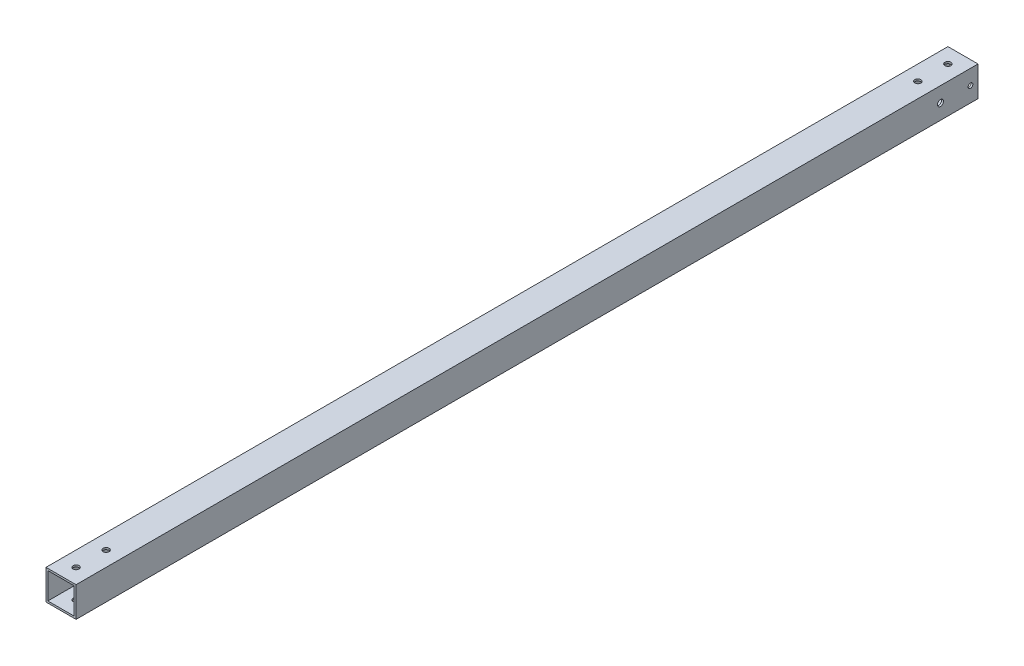
ISO-10303-21;
HEADER;
FILE_DESCRIPTION(('STEP AP214'),'2;1');
FILE_NAME('part.step','',(''),(''),'','','');
FILE_SCHEMA(('AUTOMOTIVE_DESIGN { 1 0 10303 214 1 1 1 1 }'));
ENDSEC;
DATA;
#1=APPLICATION_CONTEXT('core data for automotive mechanical design processes');
#2=APPLICATION_PROTOCOL_DEFINITION('international standard','automotive_design',2000,#1);
#3=PRODUCT_CONTEXT('',#1,'mechanical');
#4=PRODUCT('Part','Part','',(#3));
#5=PRODUCT_RELATED_PRODUCT_CATEGORY('part','',(#4));
#6=PRODUCT_DEFINITION_FORMATION('','',#4);
#7=PRODUCT_DEFINITION_CONTEXT('part definition',#1,'design');
#8=PRODUCT_DEFINITION('design','',#6,#7);
#9=PRODUCT_DEFINITION_SHAPE('','',#8);
#10=(LENGTH_UNIT() NAMED_UNIT(*) SI_UNIT(.MILLI.,.METRE.));
#11=(NAMED_UNIT(*) PLANE_ANGLE_UNIT() SI_UNIT($,.RADIAN.));
#12=(NAMED_UNIT(*) SI_UNIT($,.STERADIAN.) SOLID_ANGLE_UNIT());
#13=UNCERTAINTY_MEASURE_WITH_UNIT(LENGTH_MEASURE(1.E-05),#10,'distance_accuracy_value','');
#14=(GEOMETRIC_REPRESENTATION_CONTEXT(3) GLOBAL_UNCERTAINTY_ASSIGNED_CONTEXT((#13)) GLOBAL_UNIT_ASSIGNED_CONTEXT((#10,
#11,#12)) REPRESENTATION_CONTEXT('',''));
#15=CARTESIAN_POINT('',(0.,0.,0.));
#16=DIRECTION('',(0.,0.,1.));
#17=DIRECTION('',(1.,0.,0.));
#18=AXIS2_PLACEMENT_3D('',#15,#16,#17);
#19=CARTESIAN_POINT('',(0.,0.,762.));
#20=DIRECTION('',(0.,0.,-1.));
#21=DIRECTION('',(-1.,0.,0.));
#22=AXIS2_PLACEMENT_3D('',#19,#20,#21);
#23=PLANE('',#22);
#24=DIRECTION('',(0.,-1.,0.));
#25=VECTOR('',#24,1.);
#26=CARTESIAN_POINT('',(0.,0.,762.));
#27=LINE('',#26,#25);
#28=CARTESIAN_POINT('',(0.,25.4,762.));
#29=VERTEX_POINT('',#28);
#30=CARTESIAN_POINT('',(0.,0.,762.));
#31=VERTEX_POINT('',#30);
#32=EDGE_CURVE('E157',#29,#31,#27,.T.);
#33=ORIENTED_EDGE('',*,*,#32,.T.);
#34=DIRECTION('',(1.,0.,0.));
#35=VECTOR('',#34,1.);
#36=CARTESIAN_POINT('',(0.,0.,762.));
#37=LINE('',#36,#35);
#38=CARTESIAN_POINT('',(25.4,0.,762.));
#39=VERTEX_POINT('',#38);
#40=EDGE_CURVE('E161',#31,#39,#37,.T.);
#41=ORIENTED_EDGE('',*,*,#40,.T.);
#42=DIRECTION('',(0.,1.,0.));
#43=VECTOR('',#42,1.);
#44=CARTESIAN_POINT('',(25.4,0.,762.));
#45=LINE('',#44,#43);
#46=CARTESIAN_POINT('',(25.4,25.4,762.));
#47=VERTEX_POINT('',#46);
#48=EDGE_CURVE('E165',#39,#47,#45,.T.);
#49=ORIENTED_EDGE('',*,*,#48,.T.);
#50=DIRECTION('',(-1.,0.,0.));
#51=VECTOR('',#50,1.);
#52=CARTESIAN_POINT('',(0.,25.4,762.));
#53=LINE('',#52,#51);
#54=EDGE_CURVE('E168',#47,#29,#53,.T.);
#55=ORIENTED_EDGE('',*,*,#54,.T.);
#56=EDGE_LOOP('',(#33,#41,#49,#55));
#57=FACE_BOUND('',#56,.T.);
#58=DIRECTION('',(0.,-1.,0.));
#59=VECTOR('',#58,1.);
#60=CARTESIAN_POINT('',(1.5875,1.5875,762.));
#61=LINE('',#60,#59);
#62=CARTESIAN_POINT('',(1.5875,23.8125,762.));
#63=VERTEX_POINT('',#62);
#64=CARTESIAN_POINT('',(1.5875,1.5875,762.));
#65=VERTEX_POINT('',#64);
#66=EDGE_CURVE('E107',#63,#65,#61,.T.);
#67=ORIENTED_EDGE('',*,*,#66,.F.);
#68=DIRECTION('',(-1.,0.,0.));
#69=VECTOR('',#68,1.);
#70=CARTESIAN_POINT('',(1.5875,23.8125,762.));
#71=LINE('',#70,#69);
#72=CARTESIAN_POINT('',(23.8125,23.8125,762.));
#73=VERTEX_POINT('',#72);
#74=EDGE_CURVE('E133',#73,#63,#71,.T.);
#75=ORIENTED_EDGE('',*,*,#74,.F.);
#76=DIRECTION('',(0.,1.,0.));
#77=VECTOR('',#76,1.);
#78=CARTESIAN_POINT('',(23.8125,1.5875,762.));
#79=LINE('',#78,#77);
#80=CARTESIAN_POINT('',(23.8125,1.5875,762.));
#81=VERTEX_POINT('',#80);
#82=EDGE_CURVE('E129',#81,#73,#79,.T.);
#83=ORIENTED_EDGE('',*,*,#82,.F.);
#84=DIRECTION('',(1.,0.,0.));
#85=VECTOR('',#84,1.);
#86=CARTESIAN_POINT('',(1.5875,1.5875,762.));
#87=LINE('',#86,#85);
#88=EDGE_CURVE('E116',#65,#81,#87,.T.);
#89=ORIENTED_EDGE('',*,*,#88,.F.);
#90=EDGE_LOOP('',(#67,#75,#83,#89));
#91=FACE_BOUND('',#90,.T.);
#92=ADVANCED_FACE('F39',(#57,#91),#23,.F.);
#93=CARTESIAN_POINT('',(0.,0.,0.));
#94=DIRECTION('',(0.,0.,-1.));
#95=DIRECTION('',(-1.,0.,0.));
#96=AXIS2_PLACEMENT_3D('',#93,#94,#95);
#97=PLANE('',#96);
#98=DIRECTION('',(0.,-1.,0.));
#99=VECTOR('',#98,1.);
#100=CARTESIAN_POINT('',(0.,0.,0.));
#101=LINE('',#100,#99);
#102=CARTESIAN_POINT('',(0.,25.4,0.));
#103=VERTEX_POINT('',#102);
#104=CARTESIAN_POINT('',(0.,0.,0.));
#105=VERTEX_POINT('',#104);
#106=EDGE_CURVE('E125',#103,#105,#101,.T.);
#107=ORIENTED_EDGE('',*,*,#106,.F.);
#108=DIRECTION('',(-1.,0.,0.));
#109=VECTOR('',#108,1.);
#110=CARTESIAN_POINT('',(0.,25.4,0.));
#111=LINE('',#110,#109);
#112=CARTESIAN_POINT('',(25.4,25.4,0.));
#113=VERTEX_POINT('',#112);
#114=EDGE_CURVE('E162',#113,#103,#111,.T.);
#115=ORIENTED_EDGE('',*,*,#114,.F.);
#116=DIRECTION('',(0.,1.,0.));
#117=VECTOR('',#116,1.);
#118=CARTESIAN_POINT('',(25.4,0.,0.));
#119=LINE('',#118,#117);
#120=CARTESIAN_POINT('',(25.4,0.,0.));
#121=VERTEX_POINT('',#120);
#122=EDGE_CURVE('E178',#121,#113,#119,.T.);
#123=ORIENTED_EDGE('',*,*,#122,.F.);
#124=DIRECTION('',(1.,0.,0.));
#125=VECTOR('',#124,1.);
#126=CARTESIAN_POINT('',(0.,0.,0.));
#127=LINE('',#126,#125);
#128=EDGE_CURVE('E175',#105,#121,#127,.T.);
#129=ORIENTED_EDGE('',*,*,#128,.F.);
#130=EDGE_LOOP('',(#107,#115,#123,#129));
#131=FACE_BOUND('',#130,.T.);
#132=DIRECTION('',(-1.,0.,0.));
#133=VECTOR('',#132,1.);
#134=CARTESIAN_POINT('',(1.5875,23.8125,0.));
#135=LINE('',#134,#133);
#136=CARTESIAN_POINT('',(23.8125,23.8125,0.));
#137=VERTEX_POINT('',#136);
#138=CARTESIAN_POINT('',(1.5875,23.8125,0.));
#139=VERTEX_POINT('',#138);
#140=EDGE_CURVE('E117',#137,#139,#135,.T.);
#141=ORIENTED_EDGE('',*,*,#140,.T.);
#142=DIRECTION('',(0.,-1.,0.));
#143=VECTOR('',#142,1.);
#144=CARTESIAN_POINT('',(1.5875,1.5875,0.));
#145=LINE('',#144,#143);
#146=CARTESIAN_POINT('',(1.5875,1.5875,0.));
#147=VERTEX_POINT('',#146);
#148=EDGE_CURVE('E65',#139,#147,#145,.T.);
#149=ORIENTED_EDGE('',*,*,#148,.T.);
#150=DIRECTION('',(1.,0.,0.));
#151=VECTOR('',#150,1.);
#152=CARTESIAN_POINT('',(1.5875,1.5875,0.));
#153=LINE('',#152,#151);
#154=CARTESIAN_POINT('',(23.8125,1.5875,0.));
#155=VERTEX_POINT('',#154);
#156=EDGE_CURVE('E123',#147,#155,#153,.T.);
#157=ORIENTED_EDGE('',*,*,#156,.T.);
#158=DIRECTION('',(0.,1.,0.));
#159=VECTOR('',#158,1.);
#160=CARTESIAN_POINT('',(23.8125,1.5875,0.));
#161=LINE('',#160,#159);
#162=EDGE_CURVE('E144',#155,#137,#161,.T.);
#163=ORIENTED_EDGE('',*,*,#162,.T.);
#164=EDGE_LOOP('',(#141,#149,#157,#163));
#165=FACE_BOUND('',#164,.T.);
#166=ADVANCED_FACE('F242',(#131,#165),#97,.T.);
#167=CARTESIAN_POINT('',(0.,0.,762.));
#168=DIRECTION('',(1.,0.,0.));
#169=DIRECTION('',(0.,0.,-1.));
#170=AXIS2_PLACEMENT_3D('',#167,#168,#169);
#171=PLANE('',#170);
#172=CARTESIAN_POINT('',(0.,12.7,39.6875));
#173=DIRECTION('',(-1.,0.,0.));
#174=DIRECTION('',(0.,0.,1.));
#175=AXIS2_PLACEMENT_3D('',#172,#173,#174);
#176=CIRCLE('',#175,2.54);
#177=CARTESIAN_POINT('',(0.,12.7,42.2275));
#178=VERTEX_POINT('',#177);
#179=EDGE_CURVE('E337',#178,#178,#176,.T.);
#180=ORIENTED_EDGE('',*,*,#179,.F.);
#181=EDGE_LOOP('',(#180));
#182=FACE_BOUND('',#181,.T.);
#183=CARTESIAN_POINT('',(0.,12.7,722.3125));
#184=DIRECTION('',(-1.,0.,0.));
#185=DIRECTION('',(0.,0.,-1.));
#186=AXIS2_PLACEMENT_3D('',#183,#184,#185);
#187=CIRCLE('',#186,2.53999999999996);
#188=CARTESIAN_POINT('',(0.,12.7,724.8525));
#189=VERTEX_POINT('',#188);
#190=EDGE_CURVE('E347',#189,#189,#187,.T.);
#191=ORIENTED_EDGE('',*,*,#190,.F.);
#192=EDGE_LOOP('',(#191));
#193=FACE_BOUND('',#192,.T.);
#194=ORIENTED_EDGE('',*,*,#106,.T.);
#195=DIRECTION('',(0.,0.,-1.));
#196=VECTOR('',#195,1.);
#197=CARTESIAN_POINT('',(0.,0.,762.));
#198=LINE('',#197,#196);
#199=EDGE_CURVE('E11',#31,#105,#198,.T.);
#200=ORIENTED_EDGE('',*,*,#199,.F.);
#201=ORIENTED_EDGE('',*,*,#32,.F.);
#202=DIRECTION('',(0.,0.,-1.));
#203=VECTOR('',#202,1.);
#204=CARTESIAN_POINT('',(0.,25.4,762.));
#205=LINE('',#204,#203);
#206=EDGE_CURVE('E171',#29,#103,#205,.T.);
#207=ORIENTED_EDGE('',*,*,#206,.T.);
#208=EDGE_LOOP('',(#194,#200,#201,#207));
#209=FACE_BOUND('',#208,.T.);
#210=ADVANCED_FACE('F41',(#182,#193,#209),#171,.F.);
#211=CARTESIAN_POINT('',(0.,0.,762.));
#212=DIRECTION('',(0.,1.,0.));
#213=DIRECTION('',(0.,0.,1.));
#214=AXIS2_PLACEMENT_3D('',#211,#212,#213);
#215=PLANE('',#214);
#216=CARTESIAN_POINT('',(12.7,0.,12.7));
#217=DIRECTION('',(0.,1.,0.));
#218=DIRECTION('',(0.,0.,1.));
#219=AXIS2_PLACEMENT_3D('',#216,#217,#218);
#220=CIRCLE('',#219,2.54);
#221=CARTESIAN_POINT('',(12.7,0.,15.24));
#222=VERTEX_POINT('',#221);
#223=EDGE_CURVE('E198',#222,#222,#220,.T.);
#224=ORIENTED_EDGE('',*,*,#223,.T.);
#225=EDGE_LOOP('',(#224));
#226=FACE_BOUND('',#225,.T.);
#227=CARTESIAN_POINT('',(12.7,0.,723.9));
#228=DIRECTION('',(0.,1.,0.));
#229=DIRECTION('',(0.,0.,-1.));
#230=AXIS2_PLACEMENT_3D('',#227,#228,#229);
#231=CIRCLE('',#230,2.53999999999992);
#232=CARTESIAN_POINT('',(12.7,0.,721.36));
#233=VERTEX_POINT('',#232);
#234=EDGE_CURVE('E284',#233,#233,#231,.T.);
#235=ORIENTED_EDGE('',*,*,#234,.T.);
#236=EDGE_LOOP('',(#235));
#237=FACE_BOUND('',#236,.T.);
#238=CARTESIAN_POINT('',(12.7,0.,38.1));
#239=DIRECTION('',(0.,1.,0.));
#240=DIRECTION('',(0.,0.,1.));
#241=AXIS2_PLACEMENT_3D('',#238,#239,#240);
#242=CIRCLE('',#241,2.54);
#243=CARTESIAN_POINT('',(12.7,0.,40.64));
#244=VERTEX_POINT('',#243);
#245=EDGE_CURVE('E288',#244,#244,#242,.T.);
#246=ORIENTED_EDGE('',*,*,#245,.T.);
#247=EDGE_LOOP('',(#246));
#248=FACE_BOUND('',#247,.T.);
#249=CARTESIAN_POINT('',(12.7,0.,749.3));
#250=DIRECTION('',(0.,1.,0.));
#251=DIRECTION('',(0.,0.,-1.));
#252=AXIS2_PLACEMENT_3D('',#249,#250,#251);
#253=CIRCLE('',#252,2.53999999999994);
#254=CARTESIAN_POINT('',(12.7,0.,746.76));
#255=VERTEX_POINT('',#254);
#256=EDGE_CURVE('E292',#255,#255,#253,.T.);
#257=ORIENTED_EDGE('',*,*,#256,.T.);
#258=EDGE_LOOP('',(#257));
#259=FACE_BOUND('',#258,.T.);
#260=ORIENTED_EDGE('',*,*,#128,.T.);
#261=DIRECTION('',(0.,0.,-1.));
#262=VECTOR('',#261,1.);
#263=CARTESIAN_POINT('',(25.4,0.,762.));
#264=LINE('',#263,#262);
#265=EDGE_CURVE('E49',#39,#121,#264,.T.);
#266=ORIENTED_EDGE('',*,*,#265,.F.);
#267=ORIENTED_EDGE('',*,*,#40,.F.);
#268=ORIENTED_EDGE('',*,*,#199,.T.);
#269=EDGE_LOOP('',(#260,#266,#267,#268));
#270=FACE_BOUND('',#269,.T.);
#271=ADVANCED_FACE('F270',(#226,#237,#248,#259,#270),#215,.F.);
#272=CARTESIAN_POINT('',(25.4,0.,762.));
#273=DIRECTION('',(-1.,0.,0.));
#274=DIRECTION('',(0.,0.,1.));
#275=AXIS2_PLACEMENT_3D('',#272,#273,#274);
#276=PLANE('',#275);
#277=CARTESIAN_POINT('',(25.4,12.7,6.34999999999997));
#278=DIRECTION('',(1.,0.,0.));
#279=DIRECTION('',(0.,0.,-1.));
#280=AXIS2_PLACEMENT_3D('',#277,#278,#279);
#281=CIRCLE('',#280,2.00339978541132);
#282=CARTESIAN_POINT('',(25.4,12.7,4.34660021458865));
#283=VERTEX_POINT('',#282);
#284=EDGE_CURVE('E316',#283,#283,#281,.T.);
#285=ORIENTED_EDGE('',*,*,#284,.F.);
#286=EDGE_LOOP('',(#285));
#287=FACE_BOUND('',#286,.T.);
#288=CARTESIAN_POINT('',(25.4,12.7,31.75));
#289=DIRECTION('',(1.,0.,0.));
#290=DIRECTION('',(0.,0.,-1.));
#291=AXIS2_PLACEMENT_3D('',#288,#289,#290);
#292=CIRCLE('',#291,2.54);
#293=CARTESIAN_POINT('',(25.4,12.7,29.21));
#294=VERTEX_POINT('',#293);
#295=EDGE_CURVE('E336',#294,#294,#292,.T.);
#296=ORIENTED_EDGE('',*,*,#295,.F.);
#297=EDGE_LOOP('',(#296));
#298=FACE_BOUND('',#297,.T.);
#299=ORIENTED_EDGE('',*,*,#122,.T.);
#300=DIRECTION('',(0.,0.,-1.));
#301=VECTOR('',#300,1.);
#302=CARTESIAN_POINT('',(25.4,25.4,762.));
#303=LINE('',#302,#301);
#304=EDGE_CURVE('E186',#47,#113,#303,.T.);
#305=ORIENTED_EDGE('',*,*,#304,.F.);
#306=ORIENTED_EDGE('',*,*,#48,.F.);
#307=ORIENTED_EDGE('',*,*,#265,.T.);
#308=EDGE_LOOP('',(#299,#305,#306,#307));
#309=FACE_BOUND('',#308,.T.);
#310=ADVANCED_FACE('F267',(#287,#298,#309),#276,.F.);
#311=CARTESIAN_POINT('',(0.,25.4,762.));
#312=DIRECTION('',(0.,-1.,0.));
#313=DIRECTION('',(0.,0.,-1.));
#314=AXIS2_PLACEMENT_3D('',#311,#312,#313);
#315=PLANE('',#314);
#316=CARTESIAN_POINT('',(12.7,25.4,12.7));
#317=DIRECTION('',(0.,1.,0.));
#318=DIRECTION('',(0.,0.,1.));
#319=AXIS2_PLACEMENT_3D('',#316,#317,#318);
#320=CIRCLE('',#319,2.54);
#321=CARTESIAN_POINT('',(12.7,25.4,15.24));
#322=VERTEX_POINT('',#321);
#323=EDGE_CURVE('E326',#322,#322,#320,.T.);
#324=ORIENTED_EDGE('',*,*,#323,.F.);
#325=EDGE_LOOP('',(#324));
#326=FACE_BOUND('',#325,.T.);
#327=CARTESIAN_POINT('',(12.7,25.4,723.9));
#328=DIRECTION('',(0.,1.,0.));
#329=DIRECTION('',(0.,0.,-1.));
#330=AXIS2_PLACEMENT_3D('',#327,#328,#329);
#331=CIRCLE('',#330,2.53999999999992);
#332=CARTESIAN_POINT('',(12.7,25.4,721.36));
#333=VERTEX_POINT('',#332);
#334=EDGE_CURVE('E320',#333,#333,#331,.T.);
#335=ORIENTED_EDGE('',*,*,#334,.F.);
#336=EDGE_LOOP('',(#335));
#337=FACE_BOUND('',#336,.T.);
#338=CARTESIAN_POINT('',(12.7,25.4,38.1));
#339=DIRECTION('',(0.,1.,0.));
#340=DIRECTION('',(0.,0.,1.));
#341=AXIS2_PLACEMENT_3D('',#338,#339,#340);
#342=CIRCLE('',#341,2.54);
#343=CARTESIAN_POINT('',(12.7,25.4,40.64));
#344=VERTEX_POINT('',#343);
#345=EDGE_CURVE('E308',#344,#344,#342,.T.);
#346=ORIENTED_EDGE('',*,*,#345,.F.);
#347=EDGE_LOOP('',(#346));
#348=FACE_BOUND('',#347,.T.);
#349=CARTESIAN_POINT('',(12.7,25.4,749.3));
#350=DIRECTION('',(0.,1.,0.));
#351=DIRECTION('',(0.,0.,-1.));
#352=AXIS2_PLACEMENT_3D('',#349,#350,#351);
#353=CIRCLE('',#352,2.53999999999994);
#354=CARTESIAN_POINT('',(12.7,25.4,746.76));
#355=VERTEX_POINT('',#354);
#356=EDGE_CURVE('E309',#355,#355,#353,.T.);
#357=ORIENTED_EDGE('',*,*,#356,.F.);
#358=EDGE_LOOP('',(#357));
#359=FACE_BOUND('',#358,.T.);
#360=ORIENTED_EDGE('',*,*,#114,.T.);
#361=ORIENTED_EDGE('',*,*,#206,.F.);
#362=ORIENTED_EDGE('',*,*,#54,.F.);
#363=ORIENTED_EDGE('',*,*,#304,.T.);
#364=EDGE_LOOP('',(#360,#361,#362,#363));
#365=FACE_BOUND('',#364,.T.);
#366=ADVANCED_FACE('F264',(#326,#337,#348,#359,#365),#315,.F.);
#367=CARTESIAN_POINT('',(1.5875,1.5875,762.));
#368=DIRECTION('',(1.,0.,0.));
#369=DIRECTION('',(0.,0.,-1.));
#370=AXIS2_PLACEMENT_3D('',#367,#368,#369);
#371=PLANE('',#370);
#372=CARTESIAN_POINT('',(1.5875,12.7,39.6875));
#373=DIRECTION('',(1.,0.,0.));
#374=DIRECTION('',(0.,0.,-1.));
#375=AXIS2_PLACEMENT_3D('',#372,#373,#374);
#376=CIRCLE('',#375,2.54);
#377=CARTESIAN_POINT('',(1.5875,12.7,42.2275));
#378=VERTEX_POINT('',#377);
#379=EDGE_CURVE('E351',#378,#378,#376,.F.);
#380=ORIENTED_EDGE('',*,*,#379,.T.);
#381=EDGE_LOOP('',(#380));
#382=FACE_BOUND('',#381,.T.);
#383=CARTESIAN_POINT('',(1.5875,12.7,722.3125));
#384=DIRECTION('',(1.,0.,0.));
#385=DIRECTION('',(0.,0.,-1.));
#386=AXIS2_PLACEMENT_3D('',#383,#384,#385);
#387=CIRCLE('',#386,2.53999999999996);
#388=CARTESIAN_POINT('',(1.5875,12.7,724.8525));
#389=VERTEX_POINT('',#388);
#390=EDGE_CURVE('E352',#389,#389,#387,.F.);
#391=ORIENTED_EDGE('',*,*,#390,.T.);
#392=EDGE_LOOP('',(#391));
#393=FACE_BOUND('',#392,.T.);
#394=ORIENTED_EDGE('',*,*,#148,.F.);
#395=DIRECTION('',(0.,0.,-1.));
#396=VECTOR('',#395,1.);
#397=CARTESIAN_POINT('',(1.5875,23.8125,762.));
#398=LINE('',#397,#396);
#399=EDGE_CURVE('E111',#63,#139,#398,.T.);
#400=ORIENTED_EDGE('',*,*,#399,.F.);
#401=ORIENTED_EDGE('',*,*,#66,.T.);
#402=DIRECTION('',(0.,0.,-1.));
#403=VECTOR('',#402,1.);
#404=CARTESIAN_POINT('',(1.5875,1.5875,762.));
#405=LINE('',#404,#403);
#406=EDGE_CURVE('E110',#65,#147,#405,.T.);
#407=ORIENTED_EDGE('',*,*,#406,.T.);
#408=EDGE_LOOP('',(#394,#400,#401,#407));
#409=FACE_BOUND('',#408,.T.);
#410=ADVANCED_FACE('F109',(#382,#393,#409),#371,.T.);
#411=CARTESIAN_POINT('',(1.5875,1.5875,762.));
#412=DIRECTION('',(0.,1.,0.));
#413=DIRECTION('',(0.,0.,1.));
#414=AXIS2_PLACEMENT_3D('',#411,#412,#413);
#415=PLANE('',#414);
#416=CARTESIAN_POINT('',(12.7,1.5875,12.7));
#417=DIRECTION('',(0.,1.,0.));
#418=DIRECTION('',(0.,0.,1.));
#419=AXIS2_PLACEMENT_3D('',#416,#417,#418);
#420=CIRCLE('',#419,2.54);
#421=CARTESIAN_POINT('',(12.7,1.5875,15.24));
#422=VERTEX_POINT('',#421);
#423=EDGE_CURVE('E141',#422,#422,#420,.T.);
#424=ORIENTED_EDGE('',*,*,#423,.F.);
#425=EDGE_LOOP('',(#424));
#426=FACE_BOUND('',#425,.T.);
#427=CARTESIAN_POINT('',(12.7,1.5875,723.9));
#428=DIRECTION('',(0.,1.,0.));
#429=DIRECTION('',(0.,0.,1.));
#430=AXIS2_PLACEMENT_3D('',#427,#428,#429);
#431=CIRCLE('',#430,2.53999999999992);
#432=CARTESIAN_POINT('',(12.7,1.5875,726.44));
#433=VERTEX_POINT('',#432);
#434=EDGE_CURVE('E206',#433,#433,#431,.T.);
#435=ORIENTED_EDGE('',*,*,#434,.F.);
#436=EDGE_LOOP('',(#435));
#437=FACE_BOUND('',#436,.T.);
#438=CARTESIAN_POINT('',(12.7,1.5875,38.1));
#439=DIRECTION('',(0.,1.,0.));
#440=DIRECTION('',(0.,0.,1.));
#441=AXIS2_PLACEMENT_3D('',#438,#439,#440);
#442=CIRCLE('',#441,2.54);
#443=CARTESIAN_POINT('',(12.7,1.5875,40.64));
#444=VERTEX_POINT('',#443);
#445=EDGE_CURVE('E202',#444,#444,#442,.T.);
#446=ORIENTED_EDGE('',*,*,#445,.F.);
#447=EDGE_LOOP('',(#446));
#448=FACE_BOUND('',#447,.T.);
#449=CARTESIAN_POINT('',(12.7,1.5875,749.3));
#450=DIRECTION('',(0.,1.,0.));
#451=DIRECTION('',(0.,0.,1.));
#452=AXIS2_PLACEMENT_3D('',#449,#450,#451);
#453=CIRCLE('',#452,2.53999999999994);
#454=CARTESIAN_POINT('',(12.7,1.5875,751.84));
#455=VERTEX_POINT('',#454);
#456=EDGE_CURVE('E197',#455,#455,#453,.T.);
#457=ORIENTED_EDGE('',*,*,#456,.F.);
#458=EDGE_LOOP('',(#457));
#459=FACE_BOUND('',#458,.T.);
#460=ORIENTED_EDGE('',*,*,#156,.F.);
#461=ORIENTED_EDGE('',*,*,#406,.F.);
#462=ORIENTED_EDGE('',*,*,#88,.T.);
#463=DIRECTION('',(0.,0.,-1.));
#464=VECTOR('',#463,1.);
#465=CARTESIAN_POINT('',(23.8125,1.5875,762.));
#466=LINE('',#465,#464);
#467=EDGE_CURVE('E126',#81,#155,#466,.T.);
#468=ORIENTED_EDGE('',*,*,#467,.T.);
#469=EDGE_LOOP('',(#460,#461,#462,#468));
#470=FACE_BOUND('',#469,.T.);
#471=ADVANCED_FACE('F120',(#426,#437,#448,#459,#470),#415,.T.);
#472=CARTESIAN_POINT('',(23.8125,1.5875,762.));
#473=DIRECTION('',(-1.,0.,0.));
#474=DIRECTION('',(0.,0.,1.));
#475=AXIS2_PLACEMENT_3D('',#472,#473,#474);
#476=PLANE('',#475);
#477=CARTESIAN_POINT('',(23.8125,12.7,6.34999999999997));
#478=DIRECTION('',(-1.,0.,0.));
#479=DIRECTION('',(0.,0.,1.));
#480=AXIS2_PLACEMENT_3D('',#477,#478,#479);
#481=CIRCLE('',#480,2.00339978541132);
#482=CARTESIAN_POINT('',(23.8125,12.7,4.34660021458865));
#483=VERTEX_POINT('',#482);
#484=EDGE_CURVE('E341',#483,#483,#481,.F.);
#485=ORIENTED_EDGE('',*,*,#484,.T.);
#486=EDGE_LOOP('',(#485));
#487=FACE_BOUND('',#486,.T.);
#488=CARTESIAN_POINT('',(23.8125,12.7,31.75));
#489=DIRECTION('',(-1.,0.,0.));
#490=DIRECTION('',(0.,0.,1.));
#491=AXIS2_PLACEMENT_3D('',#488,#489,#490);
#492=CIRCLE('',#491,2.54);
#493=CARTESIAN_POINT('',(23.8125,12.7,29.21));
#494=VERTEX_POINT('',#493);
#495=EDGE_CURVE('E332',#494,#494,#492,.F.);
#496=ORIENTED_EDGE('',*,*,#495,.T.);
#497=EDGE_LOOP('',(#496));
#498=FACE_BOUND('',#497,.T.);
#499=ORIENTED_EDGE('',*,*,#162,.F.);
#500=ORIENTED_EDGE('',*,*,#467,.F.);
#501=ORIENTED_EDGE('',*,*,#82,.T.);
#502=DIRECTION('',(0.,0.,-1.));
#503=VECTOR('',#502,1.);
#504=CARTESIAN_POINT('',(23.8125,23.8125,762.));
#505=LINE('',#504,#503);
#506=EDGE_CURVE('E57',#73,#137,#505,.T.);
#507=ORIENTED_EDGE('',*,*,#506,.T.);
#508=EDGE_LOOP('',(#499,#500,#501,#507));
#509=FACE_BOUND('',#508,.T.);
#510=ADVANCED_FACE('F234',(#487,#498,#509),#476,.T.);
#511=CARTESIAN_POINT('',(1.5875,23.8125,762.));
#512=DIRECTION('',(0.,-1.,0.));
#513=DIRECTION('',(0.,0.,-1.));
#514=AXIS2_PLACEMENT_3D('',#511,#512,#513);
#515=PLANE('',#514);
#516=CARTESIAN_POINT('',(12.7,23.8125,12.7));
#517=DIRECTION('',(0.,-1.,0.));
#518=DIRECTION('',(0.,0.,-1.));
#519=AXIS2_PLACEMENT_3D('',#516,#517,#518);
#520=CIRCLE('',#519,2.54);
#521=CARTESIAN_POINT('',(12.7,23.8125,10.16));
#522=VERTEX_POINT('',#521);
#523=EDGE_CURVE('E43',#522,#522,#520,.T.);
#524=ORIENTED_EDGE('',*,*,#523,.F.);
#525=EDGE_LOOP('',(#524));
#526=FACE_BOUND('',#525,.T.);
#527=CARTESIAN_POINT('',(12.7,23.8125,723.9));
#528=DIRECTION('',(0.,-1.,0.));
#529=DIRECTION('',(0.,0.,-1.));
#530=AXIS2_PLACEMENT_3D('',#527,#528,#529);
#531=CIRCLE('',#530,2.53999999999992);
#532=CARTESIAN_POINT('',(12.7,23.8125,721.36));
#533=VERTEX_POINT('',#532);
#534=EDGE_CURVE('E203',#533,#533,#531,.T.);
#535=ORIENTED_EDGE('',*,*,#534,.F.);
#536=EDGE_LOOP('',(#535));
#537=FACE_BOUND('',#536,.T.);
#538=CARTESIAN_POINT('',(12.7,23.8125,38.1));
#539=DIRECTION('',(0.,-1.,0.));
#540=DIRECTION('',(0.,0.,-1.));
#541=AXIS2_PLACEMENT_3D('',#538,#539,#540);
#542=CIRCLE('',#541,2.54);
#543=CARTESIAN_POINT('',(12.7,23.8125,35.56));
#544=VERTEX_POINT('',#543);
#545=EDGE_CURVE('E199',#544,#544,#542,.T.);
#546=ORIENTED_EDGE('',*,*,#545,.F.);
#547=EDGE_LOOP('',(#546));
#548=FACE_BOUND('',#547,.T.);
#549=CARTESIAN_POINT('',(12.7,23.8125,749.3));
#550=DIRECTION('',(0.,-1.,0.));
#551=DIRECTION('',(0.,0.,-1.));
#552=AXIS2_PLACEMENT_3D('',#549,#550,#551);
#553=CIRCLE('',#552,2.53999999999994);
#554=CARTESIAN_POINT('',(12.7,23.8125,746.76));
#555=VERTEX_POINT('',#554);
#556=EDGE_CURVE('E193',#555,#555,#553,.T.);
#557=ORIENTED_EDGE('',*,*,#556,.F.);
#558=EDGE_LOOP('',(#557));
#559=FACE_BOUND('',#558,.T.);
#560=ORIENTED_EDGE('',*,*,#140,.F.);
#561=ORIENTED_EDGE('',*,*,#506,.F.);
#562=ORIENTED_EDGE('',*,*,#74,.T.);
#563=ORIENTED_EDGE('',*,*,#399,.T.);
#564=EDGE_LOOP('',(#560,#561,#562,#563));
#565=FACE_BOUND('',#564,.T.);
#566=ADVANCED_FACE('F230',(#526,#537,#548,#559,#565),#515,.T.);
#567=CARTESIAN_POINT('',(12.7,0.,749.3));
#568=DIRECTION('',(0.,1.,0.));
#569=DIRECTION('',(0.,0.,1.));
#570=AXIS2_PLACEMENT_3D('',#567,#568,#569);
#571=CYLINDRICAL_SURFACE('',#570,2.53999999999994);
#572=ORIENTED_EDGE('',*,*,#556,.T.);
#573=EDGE_LOOP('',(#572));
#574=FACE_BOUND('',#573,.T.);
#575=ORIENTED_EDGE('',*,*,#356,.T.);
#576=EDGE_LOOP('',(#575));
#577=FACE_BOUND('',#576,.T.);
#578=ADVANCED_FACE('F233',(#574,#577),#571,.F.);
#579=CARTESIAN_POINT('',(12.7,0.,38.1));
#580=DIRECTION('',(0.,1.,0.));
#581=DIRECTION('',(0.,0.,1.));
#582=AXIS2_PLACEMENT_3D('',#579,#580,#581);
#583=CYLINDRICAL_SURFACE('',#582,2.54);
#584=ORIENTED_EDGE('',*,*,#545,.T.);
#585=EDGE_LOOP('',(#584));
#586=FACE_BOUND('',#585,.T.);
#587=ORIENTED_EDGE('',*,*,#345,.T.);
#588=EDGE_LOOP('',(#587));
#589=FACE_BOUND('',#588,.T.);
#590=ADVANCED_FACE('F396',(#586,#589),#583,.F.);
#591=CARTESIAN_POINT('',(12.7,0.,723.9));
#592=DIRECTION('',(0.,1.,0.));
#593=DIRECTION('',(0.,0.,1.));
#594=AXIS2_PLACEMENT_3D('',#591,#592,#593);
#595=CYLINDRICAL_SURFACE('',#594,2.53999999999992);
#596=ORIENTED_EDGE('',*,*,#534,.T.);
#597=EDGE_LOOP('',(#596));
#598=FACE_BOUND('',#597,.T.);
#599=ORIENTED_EDGE('',*,*,#334,.T.);
#600=EDGE_LOOP('',(#599));
#601=FACE_BOUND('',#600,.T.);
#602=ADVANCED_FACE('F393',(#598,#601),#595,.F.);
#603=CARTESIAN_POINT('',(12.7,0.,12.7));
#604=DIRECTION('',(0.,1.,0.));
#605=DIRECTION('',(0.,0.,1.));
#606=AXIS2_PLACEMENT_3D('',#603,#604,#605);
#607=CYLINDRICAL_SURFACE('',#606,2.54);
#608=ORIENTED_EDGE('',*,*,#523,.T.);
#609=EDGE_LOOP('',(#608));
#610=FACE_BOUND('',#609,.T.);
#611=ORIENTED_EDGE('',*,*,#323,.T.);
#612=EDGE_LOOP('',(#611));
#613=FACE_BOUND('',#612,.T.);
#614=ADVANCED_FACE('F227',(#610,#613),#607,.F.);
#615=ORIENTED_EDGE('',*,*,#456,.T.);
#616=EDGE_LOOP('',(#615));
#617=FACE_BOUND('',#616,.T.);
#618=ORIENTED_EDGE('',*,*,#256,.F.);
#619=EDGE_LOOP('',(#618));
#620=FACE_BOUND('',#619,.T.);
#621=ADVANCED_FACE('F392',(#617,#620),#571,.F.);
#622=ORIENTED_EDGE('',*,*,#445,.T.);
#623=EDGE_LOOP('',(#622));
#624=FACE_BOUND('',#623,.T.);
#625=ORIENTED_EDGE('',*,*,#245,.F.);
#626=EDGE_LOOP('',(#625));
#627=FACE_BOUND('',#626,.T.);
#628=ADVANCED_FACE('F401',(#624,#627),#583,.F.);
#629=ORIENTED_EDGE('',*,*,#434,.T.);
#630=EDGE_LOOP('',(#629));
#631=FACE_BOUND('',#630,.T.);
#632=ORIENTED_EDGE('',*,*,#234,.F.);
#633=EDGE_LOOP('',(#632));
#634=FACE_BOUND('',#633,.T.);
#635=ADVANCED_FACE('F397',(#631,#634),#595,.F.);
#636=ORIENTED_EDGE('',*,*,#423,.T.);
#637=EDGE_LOOP('',(#636));
#638=FACE_BOUND('',#637,.T.);
#639=ORIENTED_EDGE('',*,*,#223,.F.);
#640=EDGE_LOOP('',(#639));
#641=FACE_BOUND('',#640,.T.);
#642=ADVANCED_FACE('F388',(#638,#641),#607,.F.);
#643=CARTESIAN_POINT('',(-0.001000000000001,12.7,31.75));
#644=DIRECTION('',(1.,0.,0.));
#645=DIRECTION('',(0.,0.,-1.));
#646=AXIS2_PLACEMENT_3D('',#643,#644,#645);
#647=CYLINDRICAL_SURFACE('',#646,2.54);
#648=CARTESIAN_POINT('',(23.8125,12.7,29.21));
#649=CARTESIAN_POINT('',(23.8290364583333,12.7,29.21));
#650=CARTESIAN_POINT('',(23.8455729166667,12.7,29.21));
#651=CARTESIAN_POINT('',(23.8786458333333,12.7,29.21));
#652=CARTESIAN_POINT('',(23.8951822916667,12.7,29.21));
#653=CARTESIAN_POINT('',(23.9282552083333,12.7,29.21));
#654=CARTESIAN_POINT('',(23.9447916666667,12.7,29.21));
#655=CARTESIAN_POINT('',(23.9778645833333,12.7,29.21));
#656=CARTESIAN_POINT('',(23.9944010416667,12.7,29.21));
#657=CARTESIAN_POINT('',(24.0274739583333,12.7,29.21));
#658=CARTESIAN_POINT('',(24.0440104166667,12.7,29.21));
#659=CARTESIAN_POINT('',(24.0770833333333,12.7,29.21));
#660=CARTESIAN_POINT('',(24.0936197916667,12.7,29.21));
#661=CARTESIAN_POINT('',(24.1266927083333,12.7,29.21));
#662=CARTESIAN_POINT('',(24.1432291666667,12.7,29.21));
#663=CARTESIAN_POINT('',(24.1763020833333,12.7,29.21));
#664=CARTESIAN_POINT('',(24.1928385416667,12.7,29.21));
#665=CARTESIAN_POINT('',(24.2259114583333,12.7,29.21));
#666=CARTESIAN_POINT('',(24.2424479166667,12.7,29.21));
#667=CARTESIAN_POINT('',(24.2755208333333,12.7,29.21));
#668=CARTESIAN_POINT('',(24.2920572916667,12.7,29.21));
#669=CARTESIAN_POINT('',(24.3251302083333,12.7,29.21));
#670=CARTESIAN_POINT('',(24.3416666666667,12.7,29.21));
#671=CARTESIAN_POINT('',(24.3747395833333,12.7,29.21));
#672=CARTESIAN_POINT('',(24.3912760416667,12.7,29.21));
#673=CARTESIAN_POINT('',(24.4243489583333,12.7,29.21));
#674=CARTESIAN_POINT('',(24.4408854166667,12.7,29.21));
#675=CARTESIAN_POINT('',(24.4739583333333,12.7,29.21));
#676=CARTESIAN_POINT('',(24.4904947916667,12.7,29.21));
#677=CARTESIAN_POINT('',(24.5235677083333,12.7,29.21));
#678=CARTESIAN_POINT('',(24.5401041666667,12.7,29.21));
#679=CARTESIAN_POINT('',(24.5731770833333,12.7,29.21));
#680=CARTESIAN_POINT('',(24.5897135416667,12.7,29.21));
#681=CARTESIAN_POINT('',(24.6227864583333,12.7,29.21));
#682=CARTESIAN_POINT('',(24.6393229166667,12.7,29.21));
#683=CARTESIAN_POINT('',(24.6723958333333,12.7,29.21));
#684=CARTESIAN_POINT('',(24.6889322916667,12.7,29.21));
#685=CARTESIAN_POINT('',(24.7220052083333,12.7,29.21));
#686=CARTESIAN_POINT('',(24.7385416666667,12.7,29.21));
#687=CARTESIAN_POINT('',(24.7716145833333,12.7,29.21));
#688=CARTESIAN_POINT('',(24.7881510416667,12.7,29.21));
#689=CARTESIAN_POINT('',(24.8212239583333,12.7,29.21));
#690=CARTESIAN_POINT('',(24.8377604166667,12.7,29.21));
#691=CARTESIAN_POINT('',(24.8708333333333,12.7,29.21));
#692=CARTESIAN_POINT('',(24.8873697916667,12.7,29.21));
#693=CARTESIAN_POINT('',(24.9204427083333,12.7,29.21));
#694=CARTESIAN_POINT('',(24.9369791666667,12.7,29.21));
#695=CARTESIAN_POINT('',(24.9700520833333,12.7,29.21));
#696=CARTESIAN_POINT('',(24.9865885416667,12.7,29.21));
#697=CARTESIAN_POINT('',(25.0196614583333,12.7,29.21));
#698=CARTESIAN_POINT('',(25.0361979166667,12.7,29.21));
#699=CARTESIAN_POINT('',(25.0692708333333,12.7,29.21));
#700=CARTESIAN_POINT('',(25.0858072916667,12.7,29.21));
#701=CARTESIAN_POINT('',(25.1188802083333,12.7,29.21));
#702=CARTESIAN_POINT('',(25.1354166666667,12.7,29.21));
#703=CARTESIAN_POINT('',(25.1684895833333,12.7,29.21));
#704=CARTESIAN_POINT('',(25.1850260416667,12.7,29.21));
#705=CARTESIAN_POINT('',(25.2180989583333,12.7,29.21));
#706=CARTESIAN_POINT('',(25.2346354166667,12.7,29.21));
#707=CARTESIAN_POINT('',(25.2677083333333,12.7,29.21));
#708=CARTESIAN_POINT('',(25.2842447916667,12.7,29.21));
#709=CARTESIAN_POINT('',(25.3173177083333,12.7,29.21));
#710=CARTESIAN_POINT('',(25.3338541666667,12.7,29.21));
#711=CARTESIAN_POINT('',(25.3669270833333,12.7,29.21));
#712=CARTESIAN_POINT('',(25.3834635416667,12.7,29.21));
#713=CARTESIAN_POINT('',(25.4,12.7,29.21));
#714=B_SPLINE_CURVE_WITH_KNOTS('',3,(#648,#649,#650,#651,#652,#653,#654,#655,#656,#657,#658,
#659,#660,#661,#662,#663,#664,#665,#666,#667,#668,#669,#670,#671,#672,#673,#674,#675,#676,#677,
#678,#679,#680,#681,#682,#683,#684,#685,#686,#687,#688,#689,#690,#691,#692,#693,#694,#695,#696,
#697,#698,#699,#700,#701,#702,#703,#704,#705,#706,#707,#708,#709,#710,#711,#712,#713),
.UNSPECIFIED.,.F.,.F.,(4,2,2,2,2,2,2,2,2,2,2,2,2,2,2,2,2,2,2,2,2,2,2,2,2,2,2,2,2,2,2,2,4),(0.,
0.0496093749999989,0.0992187499999977,0.148828125,0.198437499999999,0.248046874999998,
0.29765625,0.347265624999999,0.396874999999998,0.446484374999997,0.496093749999996,
0.545703124999998,0.595312499999997,0.644921874999996,0.694531249999998,0.744140624999997,
0.793749999999996,0.843359374999995,0.892968749999994,0.942578124999996,0.992187499999995,
1.04179687499999,1.09140625,1.14101562499999,1.19062499999999,1.24023437499999,1.28984374999999,
1.33945312499999,1.38906249999999,1.43867187499999,1.48828124999999,1.53789062499999,
1.58749999999999),.UNSPECIFIED.);
#715=EDGE_CURVE('BSEAM381',#494,#294,#714,.T.);
#716=ORIENTED_EDGE('',*,*,#495,.F.);
#717=ORIENTED_EDGE('',*,*,#295,.T.);
#718=ORIENTED_EDGE('',*,*,#715,.T.);
#719=ORIENTED_EDGE('',*,*,#715,.F.);
#720=EDGE_LOOP('',(#716,#718,#717,#719));
#721=FACE_BOUND('',#720,.T.);
#722=ADVANCED_FACE('F381',(#721),#647,.F.);
#723=CARTESIAN_POINT('',(-0.001000000000001,12.7,6.34999999999997));
#724=DIRECTION('',(1.,0.,0.));
#725=DIRECTION('',(0.,0.,-1.));
#726=AXIS2_PLACEMENT_3D('',#723,#724,#725);
#727=CYLINDRICAL_SURFACE('',#726,2.00339978541132);
#728=CARTESIAN_POINT('',(23.8125,12.7,4.34660021458865));
#729=CARTESIAN_POINT('',(23.8290364583333,12.7,4.34660021458865));
#730=CARTESIAN_POINT('',(23.8455729166667,12.7,4.34660021458865));
#731=CARTESIAN_POINT('',(23.8786458333333,12.7,4.34660021458865));
#732=CARTESIAN_POINT('',(23.8951822916667,12.7,4.34660021458865));
#733=CARTESIAN_POINT('',(23.9282552083333,12.7,4.34660021458865));
#734=CARTESIAN_POINT('',(23.9447916666667,12.7,4.34660021458865));
#735=CARTESIAN_POINT('',(23.9778645833333,12.7,4.34660021458865));
#736=CARTESIAN_POINT('',(23.9944010416667,12.7,4.34660021458865));
#737=CARTESIAN_POINT('',(24.0274739583333,12.7,4.34660021458865));
#738=CARTESIAN_POINT('',(24.0440104166667,12.7,4.34660021458865));
#739=CARTESIAN_POINT('',(24.0770833333333,12.7,4.34660021458865));
#740=CARTESIAN_POINT('',(24.0936197916667,12.7,4.34660021458865));
#741=CARTESIAN_POINT('',(24.1266927083333,12.7,4.34660021458865));
#742=CARTESIAN_POINT('',(24.1432291666667,12.7,4.34660021458865));
#743=CARTESIAN_POINT('',(24.1763020833333,12.7,4.34660021458865));
#744=CARTESIAN_POINT('',(24.1928385416667,12.7,4.34660021458865));
#745=CARTESIAN_POINT('',(24.2259114583333,12.7,4.34660021458865));
#746=CARTESIAN_POINT('',(24.2424479166667,12.7,4.34660021458865));
#747=CARTESIAN_POINT('',(24.2755208333333,12.7,4.34660021458865));
#748=CARTESIAN_POINT('',(24.2920572916667,12.7,4.34660021458865));
#749=CARTESIAN_POINT('',(24.3251302083333,12.7,4.34660021458865));
#750=CARTESIAN_POINT('',(24.3416666666667,12.7,4.34660021458865));
#751=CARTESIAN_POINT('',(24.3747395833333,12.7,4.34660021458865));
#752=CARTESIAN_POINT('',(24.3912760416667,12.7,4.34660021458865));
#753=CARTESIAN_POINT('',(24.4243489583333,12.7,4.34660021458865));
#754=CARTESIAN_POINT('',(24.4408854166667,12.7,4.34660021458865));
#755=CARTESIAN_POINT('',(24.4739583333333,12.7,4.34660021458865));
#756=CARTESIAN_POINT('',(24.4904947916667,12.7,4.34660021458865));
#757=CARTESIAN_POINT('',(24.5235677083333,12.7,4.34660021458865));
#758=CARTESIAN_POINT('',(24.5401041666667,12.7,4.34660021458865));
#759=CARTESIAN_POINT('',(24.5731770833333,12.7,4.34660021458865));
#760=CARTESIAN_POINT('',(24.5897135416667,12.7,4.34660021458865));
#761=CARTESIAN_POINT('',(24.6227864583333,12.7,4.34660021458865));
#762=CARTESIAN_POINT('',(24.6393229166667,12.7,4.34660021458865));
#763=CARTESIAN_POINT('',(24.6723958333333,12.7,4.34660021458865));
#764=CARTESIAN_POINT('',(24.6889322916667,12.7,4.34660021458865));
#765=CARTESIAN_POINT('',(24.7220052083333,12.7,4.34660021458865));
#766=CARTESIAN_POINT('',(24.7385416666667,12.7,4.34660021458865));
#767=CARTESIAN_POINT('',(24.7716145833333,12.7,4.34660021458865));
#768=CARTESIAN_POINT('',(24.7881510416667,12.7,4.34660021458865));
#769=CARTESIAN_POINT('',(24.8212239583333,12.7,4.34660021458865));
#770=CARTESIAN_POINT('',(24.8377604166667,12.7,4.34660021458865));
#771=CARTESIAN_POINT('',(24.8708333333333,12.7,4.34660021458865));
#772=CARTESIAN_POINT('',(24.8873697916667,12.7,4.34660021458865));
#773=CARTESIAN_POINT('',(24.9204427083333,12.7,4.34660021458865));
#774=CARTESIAN_POINT('',(24.9369791666667,12.7,4.34660021458865));
#775=CARTESIAN_POINT('',(24.9700520833333,12.7,4.34660021458865));
#776=CARTESIAN_POINT('',(24.9865885416667,12.7,4.34660021458865));
#777=CARTESIAN_POINT('',(25.0196614583333,12.7,4.34660021458865));
#778=CARTESIAN_POINT('',(25.0361979166667,12.7,4.34660021458865));
#779=CARTESIAN_POINT('',(25.0692708333333,12.7,4.34660021458865));
#780=CARTESIAN_POINT('',(25.0858072916667,12.7,4.34660021458865));
#781=CARTESIAN_POINT('',(25.1188802083333,12.7,4.34660021458865));
#782=CARTESIAN_POINT('',(25.1354166666667,12.7,4.34660021458865));
#783=CARTESIAN_POINT('',(25.1684895833333,12.7,4.34660021458865));
#784=CARTESIAN_POINT('',(25.1850260416667,12.7,4.34660021458865));
#785=CARTESIAN_POINT('',(25.2180989583333,12.7,4.34660021458865));
#786=CARTESIAN_POINT('',(25.2346354166667,12.7,4.34660021458865));
#787=CARTESIAN_POINT('',(25.2677083333333,12.7,4.34660021458865));
#788=CARTESIAN_POINT('',(25.2842447916667,12.7,4.34660021458865));
#789=CARTESIAN_POINT('',(25.3173177083333,12.7,4.34660021458865));
#790=CARTESIAN_POINT('',(25.3338541666667,12.7,4.34660021458865));
#791=CARTESIAN_POINT('',(25.3669270833333,12.7,4.34660021458865));
#792=CARTESIAN_POINT('',(25.3834635416667,12.7,4.34660021458865));
#793=CARTESIAN_POINT('',(25.4,12.7,4.34660021458865));
#794=B_SPLINE_CURVE_WITH_KNOTS('',3,(#728,#729,#730,#731,#732,#733,#734,#735,#736,#737,#738,
#739,#740,#741,#742,#743,#744,#745,#746,#747,#748,#749,#750,#751,#752,#753,#754,#755,#756,#757,
#758,#759,#760,#761,#762,#763,#764,#765,#766,#767,#768,#769,#770,#771,#772,#773,#774,#775,#776,
#777,#778,#779,#780,#781,#782,#783,#784,#785,#786,#787,#788,#789,#790,#791,#792,#793),
.UNSPECIFIED.,.F.,.F.,(4,2,2,2,2,2,2,2,2,2,2,2,2,2,2,2,2,2,2,2,2,2,2,2,2,2,2,2,2,2,2,2,4),(0.,
0.0496093749999989,0.0992187499999977,0.148828125,0.198437499999999,0.248046874999998,
0.29765625,0.347265624999999,0.396874999999998,0.446484374999997,0.496093749999996,
0.545703124999998,0.595312499999997,0.644921874999996,0.694531249999998,0.744140624999997,
0.793749999999996,0.843359374999995,0.892968749999994,0.942578124999996,0.992187499999995,
1.04179687499999,1.09140625,1.14101562499999,1.19062499999999,1.24023437499999,1.28984374999999,
1.33945312499999,1.38906249999999,1.43867187499999,1.48828124999999,1.53789062499999,
1.58749999999999),.UNSPECIFIED.);
#795=EDGE_CURVE('BSEAM375',#483,#283,#794,.T.);
#796=ORIENTED_EDGE('',*,*,#484,.F.);
#797=ORIENTED_EDGE('',*,*,#284,.T.);
#798=ORIENTED_EDGE('',*,*,#795,.T.);
#799=ORIENTED_EDGE('',*,*,#795,.F.);
#800=EDGE_LOOP('',(#796,#798,#797,#799));
#801=FACE_BOUND('',#800,.T.);
#802=ADVANCED_FACE('F375',(#801),#727,.F.);
#803=CARTESIAN_POINT('',(25.401,12.7,722.3125));
#804=DIRECTION('',(-1.,0.,0.));
#805=DIRECTION('',(0.,0.,1.));
#806=AXIS2_PLACEMENT_3D('',#803,#804,#805);
#807=CYLINDRICAL_SURFACE('',#806,2.53999999999996);
#808=CARTESIAN_POINT('',(1.5875,12.7,724.8525));
#809=CARTESIAN_POINT('',(1.57096354166666,12.7,724.8525));
#810=CARTESIAN_POINT('',(1.55442708333333,12.7,724.8525));
#811=CARTESIAN_POINT('',(1.52135416666666,12.7,724.8525));
#812=CARTESIAN_POINT('',(1.50481770833333,12.7,724.8525));
#813=CARTESIAN_POINT('',(1.47174479166666,12.7,724.8525));
#814=CARTESIAN_POINT('',(1.45520833333333,12.7,724.8525));
#815=CARTESIAN_POINT('',(1.42213541666666,12.7,724.8525));
#816=CARTESIAN_POINT('',(1.40559895833333,12.7,724.8525));
#817=CARTESIAN_POINT('',(1.37252604166666,12.7,724.8525));
#818=CARTESIAN_POINT('',(1.35598958333333,12.7,724.8525));
#819=CARTESIAN_POINT('',(1.32291666666666,12.7,724.8525));
#820=CARTESIAN_POINT('',(1.30638020833333,12.7,724.8525));
#821=CARTESIAN_POINT('',(1.27330729166666,12.7,724.8525));
#822=CARTESIAN_POINT('',(1.25677083333333,12.7,724.8525));
#823=CARTESIAN_POINT('',(1.22369791666666,12.7,724.8525));
#824=CARTESIAN_POINT('',(1.20716145833333,12.7,724.8525));
#825=CARTESIAN_POINT('',(1.17408854166666,12.7,724.8525));
#826=CARTESIAN_POINT('',(1.15755208333333,12.7,724.8525));
#827=CARTESIAN_POINT('',(1.12447916666667,12.7,724.8525));
#828=CARTESIAN_POINT('',(1.10794270833333,12.7,724.8525));
#829=CARTESIAN_POINT('',(1.07486979166667,12.7,724.8525));
#830=CARTESIAN_POINT('',(1.05833333333333,12.7,724.8525));
#831=CARTESIAN_POINT('',(1.02526041666666,12.7,724.8525));
#832=CARTESIAN_POINT('',(1.00872395833333,12.7,724.8525));
#833=CARTESIAN_POINT('',(0.975651041666665,12.7,724.8525));
#834=CARTESIAN_POINT('',(0.959114583333332,12.7,724.8525));
#835=CARTESIAN_POINT('',(0.926041666666665,12.7,724.8525));
#836=CARTESIAN_POINT('',(0.909505208333331,12.7,724.8525));
#837=CARTESIAN_POINT('',(0.876432291666664,12.7,724.8525));
#838=CARTESIAN_POINT('',(0.859895833333331,12.7,724.8525));
#839=CARTESIAN_POINT('',(0.826822916666665,12.7,724.8525));
#840=CARTESIAN_POINT('',(0.810286458333332,12.7,724.8525));
#841=CARTESIAN_POINT('',(0.777213541666666,12.7,724.8525));
#842=CARTESIAN_POINT('',(0.760677083333333,12.7,724.8525));
#843=CARTESIAN_POINT('',(0.727604166666667,12.7,724.8525));
#844=CARTESIAN_POINT('',(0.711067708333335,12.7,724.8525));
#845=CARTESIAN_POINT('',(0.677994791666667,12.7,724.8525));
#846=CARTESIAN_POINT('',(0.661458333333333,12.7,724.8525));
#847=CARTESIAN_POINT('',(0.628385416666666,12.7,724.8525));
#848=CARTESIAN_POINT('',(0.611848958333333,12.7,724.8525));
#849=CARTESIAN_POINT('',(0.578776041666667,12.7,724.8525));
#850=CARTESIAN_POINT('',(0.562239583333334,12.7,724.8525));
#851=CARTESIAN_POINT('',(0.529166666666667,12.7,724.8525));
#852=CARTESIAN_POINT('',(0.512630208333333,12.7,724.8525));
#853=CARTESIAN_POINT('',(0.479557291666666,12.7,724.8525));
#854=CARTESIAN_POINT('',(0.463020833333333,12.7,724.8525));
#855=CARTESIAN_POINT('',(0.429947916666667,12.7,724.8525));
#856=CARTESIAN_POINT('',(0.413411458333334,12.7,724.8525));
#857=CARTESIAN_POINT('',(0.380338541666668,12.7,724.8525));
#858=CARTESIAN_POINT('',(0.363802083333335,12.7,724.8525));
#859=CARTESIAN_POINT('',(0.33072916666667,12.7,724.8525));
#860=CARTESIAN_POINT('',(0.314192708333337,12.7,724.8525));
#861=CARTESIAN_POINT('',(0.28111979166667,12.7,724.8525));
#862=CARTESIAN_POINT('',(0.264583333333335,12.7,724.8525));
#863=CARTESIAN_POINT('',(0.231510416666668,12.7,724.8525));
#864=CARTESIAN_POINT('',(0.214973958333335,12.7,724.8525));
#865=CARTESIAN_POINT('',(0.181901041666669,12.7,724.8525));
#866=CARTESIAN_POINT('',(0.165364583333337,12.7,724.8525));
#867=CARTESIAN_POINT('',(0.132291666666669,12.7,724.8525));
#868=CARTESIAN_POINT('',(0.115755208333335,12.7,724.8525));
#869=CARTESIAN_POINT('',(0.0826822916666683,12.7,724.8525));
#870=CARTESIAN_POINT('',(0.0661458333333353,12.7,724.8525));
#871=CARTESIAN_POINT('',(0.0330729166666694,12.7,724.8525));
#872=CARTESIAN_POINT('',(0.0165364583333364,12.7,724.8525));
#873=CARTESIAN_POINT('',(0.,12.7,724.8525));
#874=B_SPLINE_CURVE_WITH_KNOTS('',3,(#808,#809,#810,#811,#812,#813,#814,#815,#816,#817,#818,
#819,#820,#821,#822,#823,#824,#825,#826,#827,#828,#829,#830,#831,#832,#833,#834,#835,#836,#837,
#838,#839,#840,#841,#842,#843,#844,#845,#846,#847,#848,#849,#850,#851,#852,#853,#854,#855,#856,
#857,#858,#859,#860,#861,#862,#863,#864,#865,#866,#867,#868,#869,#870,#871,#872,#873),
.UNSPECIFIED.,.F.,.F.,(4,2,2,2,2,2,2,2,2,2,2,2,2,2,2,2,2,2,2,2,2,2,2,2,2,2,2,2,2,2,2,2,4),(0.,
0.0496093749999989,0.0992187499999977,0.148828125,0.198437499999999,0.248046874999998,
0.29765625,0.347265624999999,0.396874999999998,0.446484374999997,0.496093749999996,
0.545703124999998,0.595312499999997,0.644921874999996,0.694531249999998,0.744140624999997,
0.793749999999996,0.843359374999995,0.892968749999994,0.942578124999996,0.992187499999995,
1.04179687499999,1.09140625,1.14101562499999,1.19062499999999,1.24023437499999,1.28984374999999,
1.33945312499999,1.38906249999999,1.43867187499999,1.48828124999999,1.53789062499999,
1.58749999999999),.UNSPECIFIED.);
#875=EDGE_CURVE('BSEAM368',#389,#189,#874,.T.);
#876=ORIENTED_EDGE('',*,*,#390,.F.);
#877=ORIENTED_EDGE('',*,*,#190,.T.);
#878=ORIENTED_EDGE('',*,*,#875,.T.);
#879=ORIENTED_EDGE('',*,*,#875,.F.);
#880=EDGE_LOOP('',(#876,#878,#877,#879));
#881=FACE_BOUND('',#880,.T.);
#882=ADVANCED_FACE('F368',(#881),#807,.F.);
#883=CARTESIAN_POINT('',(25.401,12.7,39.6875));
#884=DIRECTION('',(-1.,0.,0.));
#885=DIRECTION('',(0.,0.,1.));
#886=AXIS2_PLACEMENT_3D('',#883,#884,#885);
#887=CYLINDRICAL_SURFACE('',#886,2.54);
#888=CARTESIAN_POINT('',(1.5875,12.7,42.2275));
#889=CARTESIAN_POINT('',(1.57096354166666,12.7,42.2275));
#890=CARTESIAN_POINT('',(1.55442708333333,12.7,42.2275));
#891=CARTESIAN_POINT('',(1.52135416666666,12.7,42.2275));
#892=CARTESIAN_POINT('',(1.50481770833333,12.7,42.2275));
#893=CARTESIAN_POINT('',(1.47174479166666,12.7,42.2275));
#894=CARTESIAN_POINT('',(1.45520833333333,12.7,42.2275));
#895=CARTESIAN_POINT('',(1.42213541666666,12.7,42.2275));
#896=CARTESIAN_POINT('',(1.40559895833333,12.7,42.2275));
#897=CARTESIAN_POINT('',(1.37252604166666,12.7,42.2275));
#898=CARTESIAN_POINT('',(1.35598958333333,12.7,42.2275));
#899=CARTESIAN_POINT('',(1.32291666666666,12.7,42.2275));
#900=CARTESIAN_POINT('',(1.30638020833333,12.7,42.2275));
#901=CARTESIAN_POINT('',(1.27330729166666,12.7,42.2275));
#902=CARTESIAN_POINT('',(1.25677083333333,12.7,42.2275));
#903=CARTESIAN_POINT('',(1.22369791666666,12.7,42.2275));
#904=CARTESIAN_POINT('',(1.20716145833333,12.7,42.2275));
#905=CARTESIAN_POINT('',(1.17408854166666,12.7,42.2275));
#906=CARTESIAN_POINT('',(1.15755208333333,12.7,42.2275));
#907=CARTESIAN_POINT('',(1.12447916666667,12.7,42.2275));
#908=CARTESIAN_POINT('',(1.10794270833333,12.7,42.2275));
#909=CARTESIAN_POINT('',(1.07486979166667,12.7,42.2275));
#910=CARTESIAN_POINT('',(1.05833333333333,12.7,42.2275));
#911=CARTESIAN_POINT('',(1.02526041666666,12.7,42.2275));
#912=CARTESIAN_POINT('',(1.00872395833333,12.7,42.2275));
#913=CARTESIAN_POINT('',(0.975651041666665,12.7,42.2275));
#914=CARTESIAN_POINT('',(0.959114583333332,12.7,42.2275));
#915=CARTESIAN_POINT('',(0.926041666666665,12.7,42.2275));
#916=CARTESIAN_POINT('',(0.909505208333331,12.7,42.2275));
#917=CARTESIAN_POINT('',(0.876432291666664,12.7,42.2275));
#918=CARTESIAN_POINT('',(0.859895833333331,12.7,42.2275));
#919=CARTESIAN_POINT('',(0.826822916666665,12.7,42.2275));
#920=CARTESIAN_POINT('',(0.810286458333332,12.7,42.2275));
#921=CARTESIAN_POINT('',(0.777213541666666,12.7,42.2275));
#922=CARTESIAN_POINT('',(0.760677083333333,12.7,42.2275));
#923=CARTESIAN_POINT('',(0.727604166666667,12.7,42.2275));
#924=CARTESIAN_POINT('',(0.711067708333335,12.7,42.2275));
#925=CARTESIAN_POINT('',(0.677994791666667,12.7,42.2275));
#926=CARTESIAN_POINT('',(0.661458333333333,12.7,42.2275));
#927=CARTESIAN_POINT('',(0.628385416666666,12.7,42.2275));
#928=CARTESIAN_POINT('',(0.611848958333333,12.7,42.2275));
#929=CARTESIAN_POINT('',(0.578776041666667,12.7,42.2275));
#930=CARTESIAN_POINT('',(0.562239583333334,12.7,42.2275));
#931=CARTESIAN_POINT('',(0.529166666666667,12.7,42.2275));
#932=CARTESIAN_POINT('',(0.512630208333333,12.7,42.2275));
#933=CARTESIAN_POINT('',(0.479557291666666,12.7,42.2275));
#934=CARTESIAN_POINT('',(0.463020833333333,12.7,42.2275));
#935=CARTESIAN_POINT('',(0.429947916666667,12.7,42.2275));
#936=CARTESIAN_POINT('',(0.413411458333334,12.7,42.2275));
#937=CARTESIAN_POINT('',(0.380338541666668,12.7,42.2275));
#938=CARTESIAN_POINT('',(0.363802083333335,12.7,42.2275));
#939=CARTESIAN_POINT('',(0.33072916666667,12.7,42.2275));
#940=CARTESIAN_POINT('',(0.314192708333337,12.7,42.2275));
#941=CARTESIAN_POINT('',(0.28111979166667,12.7,42.2275));
#942=CARTESIAN_POINT('',(0.264583333333335,12.7,42.2275));
#943=CARTESIAN_POINT('',(0.231510416666668,12.7,42.2275));
#944=CARTESIAN_POINT('',(0.214973958333335,12.7,42.2275));
#945=CARTESIAN_POINT('',(0.181901041666669,12.7,42.2275));
#946=CARTESIAN_POINT('',(0.165364583333337,12.7,42.2275));
#947=CARTESIAN_POINT('',(0.132291666666669,12.7,42.2275));
#948=CARTESIAN_POINT('',(0.115755208333335,12.7,42.2275));
#949=CARTESIAN_POINT('',(0.0826822916666683,12.7,42.2275));
#950=CARTESIAN_POINT('',(0.0661458333333353,12.7,42.2275));
#951=CARTESIAN_POINT('',(0.0330729166666694,12.7,42.2275));
#952=CARTESIAN_POINT('',(0.0165364583333364,12.7,42.2275));
#953=CARTESIAN_POINT('',(0.,12.7,42.2275));
#954=B_SPLINE_CURVE_WITH_KNOTS('',3,(#888,#889,#890,#891,#892,#893,#894,#895,#896,#897,#898,
#899,#900,#901,#902,#903,#904,#905,#906,#907,#908,#909,#910,#911,#912,#913,#914,#915,#916,#917,
#918,#919,#920,#921,#922,#923,#924,#925,#926,#927,#928,#929,#930,#931,#932,#933,#934,#935,#936,
#937,#938,#939,#940,#941,#942,#943,#944,#945,#946,#947,#948,#949,#950,#951,#952,#953),
.UNSPECIFIED.,.F.,.F.,(4,2,2,2,2,2,2,2,2,2,2,2,2,2,2,2,2,2,2,2,2,2,2,2,2,2,2,2,2,2,2,2,4),(0.,
0.0496093749999989,0.0992187499999977,0.148828125,0.198437499999999,0.248046874999998,
0.29765625,0.347265624999999,0.396874999999998,0.446484374999997,0.496093749999996,
0.545703124999998,0.595312499999997,0.644921874999996,0.694531249999998,0.744140624999997,
0.793749999999996,0.843359374999995,0.892968749999994,0.942578124999996,0.992187499999995,
1.04179687499999,1.09140625,1.14101562499999,1.19062499999999,1.24023437499999,1.28984374999999,
1.33945312499999,1.38906249999999,1.43867187499999,1.48828124999999,1.53789062499999,
1.58749999999999),.UNSPECIFIED.);
#955=EDGE_CURVE('BSEAM365',#378,#178,#954,.T.);
#956=ORIENTED_EDGE('',*,*,#379,.F.);
#957=ORIENTED_EDGE('',*,*,#179,.T.);
#958=ORIENTED_EDGE('',*,*,#955,.T.);
#959=ORIENTED_EDGE('',*,*,#955,.F.);
#960=EDGE_LOOP('',(#956,#958,#957,#959));
#961=FACE_BOUND('',#960,.T.);
#962=ADVANCED_FACE('F365',(#961),#887,.F.);
#963=CLOSED_SHELL('',(#92,#166,#210,#271,#310,#366,#410,#471,#510,#566,#578,#590,#602,#614,#621,
#628,#635,#642,#722,#802,#882,#962));
#964=MANIFOLD_SOLID_BREP('B2',#963);
#965=ADVANCED_BREP_SHAPE_REPRESENTATION('',(#18,#964),#14);
#966=SHAPE_DEFINITION_REPRESENTATION(#9,#965);
ENDSEC;
END-ISO-10303-21;
